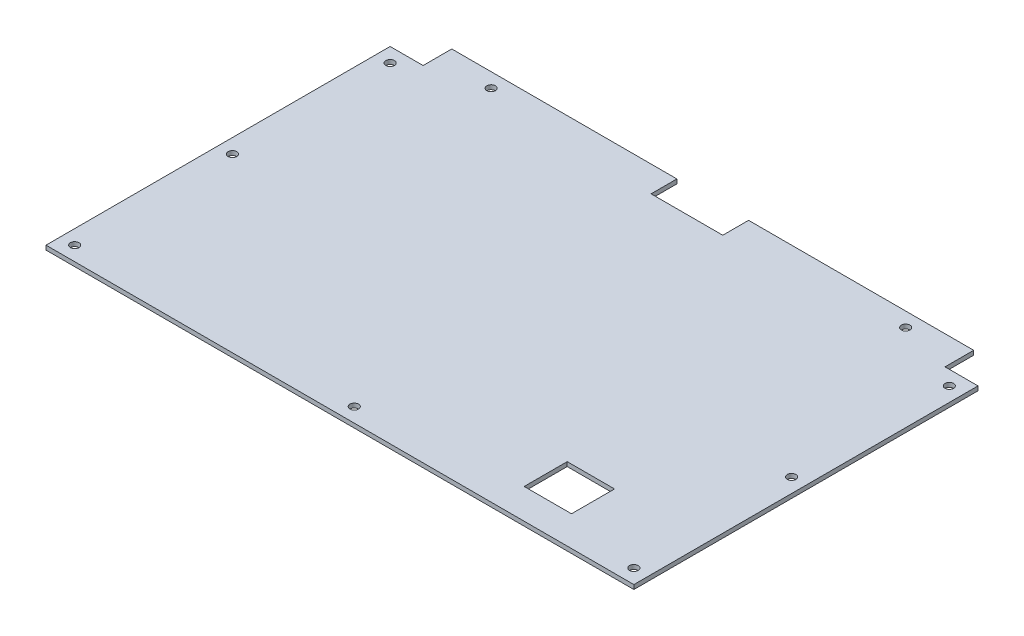
ISO-10303-21;
HEADER;
FILE_DESCRIPTION(('STEP AP214'),'2;1');
FILE_NAME('part.step','',(''),(''),'','','');
FILE_SCHEMA(('AUTOMOTIVE_DESIGN { 1 0 10303 214 1 1 1 1 }'));
ENDSEC;
DATA;
#1=APPLICATION_CONTEXT('core data for automotive mechanical design processes');
#2=APPLICATION_PROTOCOL_DEFINITION('international standard','automotive_design',2000,#1);
#3=PRODUCT_CONTEXT('',#1,'mechanical');
#4=PRODUCT('Part','Part','',(#3));
#5=PRODUCT_RELATED_PRODUCT_CATEGORY('part','',(#4));
#6=PRODUCT_DEFINITION_FORMATION('','',#4);
#7=PRODUCT_DEFINITION_CONTEXT('part definition',#1,'design');
#8=PRODUCT_DEFINITION('design','',#6,#7);
#9=PRODUCT_DEFINITION_SHAPE('','',#8);
#10=(LENGTH_UNIT() NAMED_UNIT(*) SI_UNIT(.MILLI.,.METRE.));
#11=(NAMED_UNIT(*) PLANE_ANGLE_UNIT() SI_UNIT($,.RADIAN.));
#12=(NAMED_UNIT(*) SI_UNIT($,.STERADIAN.) SOLID_ANGLE_UNIT());
#13=UNCERTAINTY_MEASURE_WITH_UNIT(LENGTH_MEASURE(1.E-05),#10,'distance_accuracy_value','');
#14=(GEOMETRIC_REPRESENTATION_CONTEXT(3) GLOBAL_UNCERTAINTY_ASSIGNED_CONTEXT((#13)) GLOBAL_UNIT_ASSIGNED_CONTEXT((#10,
#11,#12)) REPRESENTATION_CONTEXT('',''));
#15=CARTESIAN_POINT('',(0.,0.,0.));
#16=DIRECTION('',(0.,0.,1.));
#17=DIRECTION('',(1.,0.,0.));
#18=AXIS2_PLACEMENT_3D('',#15,#16,#17);
#19=CARTESIAN_POINT('',(0.,3.,0.));
#20=DIRECTION('',(0.,1.,0.));
#21=DIRECTION('',(0.,0.,1.));
#22=AXIS2_PLACEMENT_3D('',#19,#20,#21);
#23=PLANE('',#22);
#24=CARTESIAN_POINT('',(144.549746063773,3.,-130.));
#25=DIRECTION('',(0.,1.,0.));
#26=DIRECTION('',(0.,0.,1.));
#27=AXIS2_PLACEMENT_3D('',#24,#25,#26);
#28=CIRCLE('',#27,2.99999999999999);
#29=CARTESIAN_POINT('',(144.549746063773,3.,-127.));
#30=VERTEX_POINT('',#29);
#31=EDGE_CURVE('E209',#30,#30,#28,.T.);
#32=ORIENTED_EDGE('',*,*,#31,.F.);
#33=EDGE_LOOP('',(#32));
#34=FACE_BOUND('',#33,.T.);
#35=CARTESIAN_POINT('',(195.,3.,-110.));
#36=DIRECTION('',(0.,1.,0.));
#37=DIRECTION('',(0.,0.,-1.));
#38=AXIS2_PLACEMENT_3D('',#35,#36,#37);
#39=CIRCLE('',#38,2.99999999999999);
#40=CARTESIAN_POINT('',(195.,3.,-113.));
#41=VERTEX_POINT('',#40);
#42=EDGE_CURVE('E225',#41,#41,#39,.T.);
#43=ORIENTED_EDGE('',*,*,#42,.F.);
#44=EDGE_LOOP('',(#43));
#45=FACE_BOUND('',#44,.T.);
#46=CARTESIAN_POINT('',(195.,3.,110.));
#47=DIRECTION('',(0.,1.,0.));
#48=DIRECTION('',(0.,0.,1.));
#49=AXIS2_PLACEMENT_3D('',#46,#47,#48);
#50=CIRCLE('',#49,2.99999999999999);
#51=CARTESIAN_POINT('',(195.,3.,113.));
#52=VERTEX_POINT('',#51);
#53=EDGE_CURVE('E241',#52,#52,#50,.T.);
#54=ORIENTED_EDGE('',*,*,#53,.F.);
#55=EDGE_LOOP('',(#54));
#56=FACE_BOUND('',#55,.T.);
#57=CARTESIAN_POINT('',(-195.,3.,0.));
#58=DIRECTION('',(0.,1.,0.));
#59=DIRECTION('',(0.,0.,1.));
#60=AXIS2_PLACEMENT_3D('',#57,#58,#59);
#61=CIRCLE('',#60,2.99999999999999);
#62=CARTESIAN_POINT('',(-195.,3.,2.99999999999999));
#63=VERTEX_POINT('',#62);
#64=EDGE_CURVE('E257',#63,#63,#61,.T.);
#65=ORIENTED_EDGE('',*,*,#64,.F.);
#66=EDGE_LOOP('',(#65));
#67=FACE_BOUND('',#66,.T.);
#68=DIRECTION('',(0.,0.,-1.));
#69=VECTOR('',#68,1.);
#70=CARTESIAN_POINT('',(205.,3.,-120.));
#71=LINE('',#70,#69);
#72=CARTESIAN_POINT('',(205.,3.,120.));
#73=VERTEX_POINT('',#72);
#74=CARTESIAN_POINT('',(205.,3.,-120.));
#75=VERTEX_POINT('',#74);
#76=EDGE_CURVE('E273',#73,#75,#71,.T.);
#77=ORIENTED_EDGE('',*,*,#76,.T.);
#78=DIRECTION('',(-1.,0.,0.));
#79=VECTOR('',#78,1.);
#80=CARTESIAN_POINT('',(182.,3.,-120.));
#81=LINE('',#80,#79);
#82=CARTESIAN_POINT('',(182.,3.,-120.));
#83=VERTEX_POINT('',#82);
#84=EDGE_CURVE('E277',#75,#83,#81,.T.);
#85=ORIENTED_EDGE('',*,*,#84,.T.);
#86=DIRECTION('',(0.,0.,-1.));
#87=VECTOR('',#86,1.);
#88=CARTESIAN_POINT('',(182.,3.,-120.));
#89=LINE('',#88,#87);
#90=CARTESIAN_POINT('',(182.,3.,-140.));
#91=VERTEX_POINT('',#90);
#92=EDGE_CURVE('E281',#83,#91,#89,.T.);
#93=ORIENTED_EDGE('',*,*,#92,.T.);
#94=DIRECTION('',(-1.,0.,0.));
#95=VECTOR('',#94,1.);
#96=CARTESIAN_POINT('',(25.0000000000001,3.,-140.));
#97=LINE('',#96,#95);
#98=CARTESIAN_POINT('',(25.0000000000001,3.,-140.));
#99=VERTEX_POINT('',#98);
#100=EDGE_CURVE('E284',#91,#99,#97,.T.);
#101=ORIENTED_EDGE('',*,*,#100,.T.);
#102=DIRECTION('',(0.,0.,1.));
#103=VECTOR('',#102,1.);
#104=CARTESIAN_POINT('',(25.0000000000001,3.,-140.));
#105=LINE('',#104,#103);
#106=CARTESIAN_POINT('',(25.0000000000001,3.,-122.));
#107=VERTEX_POINT('',#106);
#108=EDGE_CURVE('E287',#99,#107,#105,.T.);
#109=ORIENTED_EDGE('',*,*,#108,.T.);
#110=DIRECTION('',(-1.,0.,0.));
#111=VECTOR('',#110,1.);
#112=CARTESIAN_POINT('',(-24.9999999999999,3.,-122.));
#113=LINE('',#112,#111);
#114=CARTESIAN_POINT('',(-24.9999999999999,3.,-122.));
#115=VERTEX_POINT('',#114);
#116=EDGE_CURVE('E290',#107,#115,#113,.T.);
#117=ORIENTED_EDGE('',*,*,#116,.T.);
#118=DIRECTION('',(0.,0.,-1.));
#119=VECTOR('',#118,1.);
#120=CARTESIAN_POINT('',(-24.9999999999999,3.,-122.));
#121=LINE('',#120,#119);
#122=CARTESIAN_POINT('',(-24.9999999999999,3.,-140.));
#123=VERTEX_POINT('',#122);
#124=EDGE_CURVE('E293',#115,#123,#121,.T.);
#125=ORIENTED_EDGE('',*,*,#124,.T.);
#126=DIRECTION('',(-1.,0.,0.));
#127=VECTOR('',#126,1.);
#128=CARTESIAN_POINT('',(-182.,3.,-140.));
#129=LINE('',#128,#127);
#130=CARTESIAN_POINT('',(-182.,3.,-140.));
#131=VERTEX_POINT('',#130);
#132=EDGE_CURVE('E296',#123,#131,#129,.T.);
#133=ORIENTED_EDGE('',*,*,#132,.T.);
#134=DIRECTION('',(0.,0.,1.));
#135=VECTOR('',#134,1.);
#136=CARTESIAN_POINT('',(-182.,3.,-120.));
#137=LINE('',#136,#135);
#138=CARTESIAN_POINT('',(-182.,3.,-120.));
#139=VERTEX_POINT('',#138);
#140=EDGE_CURVE('E299',#131,#139,#137,.T.);
#141=ORIENTED_EDGE('',*,*,#140,.T.);
#142=DIRECTION('',(-1.,0.,0.));
#143=VECTOR('',#142,1.);
#144=CARTESIAN_POINT('',(-205.,3.,-120.));
#145=LINE('',#144,#143);
#146=CARTESIAN_POINT('',(-205.,3.,-120.));
#147=VERTEX_POINT('',#146);
#148=EDGE_CURVE('E302',#139,#147,#145,.T.);
#149=ORIENTED_EDGE('',*,*,#148,.T.);
#150=DIRECTION('',(0.,0.,1.));
#151=VECTOR('',#150,1.);
#152=CARTESIAN_POINT('',(-205.,3.,-120.));
#153=LINE('',#152,#151);
#154=CARTESIAN_POINT('',(-205.,3.,120.));
#155=VERTEX_POINT('',#154);
#156=EDGE_CURVE('E305',#147,#155,#153,.T.);
#157=ORIENTED_EDGE('',*,*,#156,.T.);
#158=DIRECTION('',(1.,0.,0.));
#159=VECTOR('',#158,1.);
#160=CARTESIAN_POINT('',(-205.,3.,120.));
#161=LINE('',#160,#159);
#162=EDGE_CURVE('E308',#155,#73,#161,.T.);
#163=ORIENTED_EDGE('',*,*,#162,.T.);
#164=EDGE_LOOP('',(#77,#85,#93,#101,#109,#117,#125,#133,#141,#149,#157,#163));
#165=FACE_BOUND('',#164,.T.);
#166=CARTESIAN_POINT('',(-195.,3.,-110.));
#167=DIRECTION('',(0.,1.,0.));
#168=DIRECTION('',(0.,0.,1.));
#169=AXIS2_PLACEMENT_3D('',#166,#167,#168);
#170=CIRCLE('',#169,2.99999999999999);
#171=CARTESIAN_POINT('',(-195.,3.,-107.));
#172=VERTEX_POINT('',#171);
#173=EDGE_CURVE('E265',#172,#172,#170,.T.);
#174=ORIENTED_EDGE('',*,*,#173,.F.);
#175=EDGE_LOOP('',(#174));
#176=FACE_BOUND('',#175,.T.);
#177=CARTESIAN_POINT('',(-195.,3.,110.));
#178=DIRECTION('',(0.,1.,0.));
#179=DIRECTION('',(0.,0.,-1.));
#180=AXIS2_PLACEMENT_3D('',#177,#178,#179);
#181=CIRCLE('',#180,2.99999999999999);
#182=CARTESIAN_POINT('',(-195.,3.,107.));
#183=VERTEX_POINT('',#182);
#184=EDGE_CURVE('E249',#183,#183,#181,.T.);
#185=ORIENTED_EDGE('',*,*,#184,.F.);
#186=EDGE_LOOP('',(#185));
#187=FACE_BOUND('',#186,.T.);
#188=CARTESIAN_POINT('',(195.,3.,0.));
#189=DIRECTION('',(0.,1.,0.));
#190=DIRECTION('',(0.,0.,-1.));
#191=AXIS2_PLACEMENT_3D('',#188,#189,#190);
#192=CIRCLE('',#191,2.99999999999999);
#193=CARTESIAN_POINT('',(195.,3.,-2.99999999999999));
#194=VERTEX_POINT('',#193);
#195=EDGE_CURVE('E233',#194,#194,#192,.T.);
#196=ORIENTED_EDGE('',*,*,#195,.F.);
#197=EDGE_LOOP('',(#196));
#198=FACE_BOUND('',#197,.T.);
#199=CARTESIAN_POINT('',(0.,3.,110.));
#200=DIRECTION('',(0.,1.,0.));
#201=DIRECTION('',(0.,0.,1.));
#202=AXIS2_PLACEMENT_3D('',#199,#200,#201);
#203=CIRCLE('',#202,3.);
#204=CARTESIAN_POINT('',(0.,3.,113.));
#205=VERTEX_POINT('',#204);
#206=EDGE_CURVE('E217',#205,#205,#203,.T.);
#207=ORIENTED_EDGE('',*,*,#206,.F.);
#208=EDGE_LOOP('',(#207));
#209=FACE_BOUND('',#208,.T.);
#210=CARTESIAN_POINT('',(-144.549746063773,3.,-130.));
#211=DIRECTION('',(0.,1.,0.));
#212=DIRECTION('',(0.,0.,-1.));
#213=AXIS2_PLACEMENT_3D('',#210,#211,#212);
#214=CIRCLE('',#213,2.99999999999999);
#215=CARTESIAN_POINT('',(-144.549746063773,3.,-133.));
#216=VERTEX_POINT('',#215);
#217=EDGE_CURVE('E201',#216,#216,#214,.T.);
#218=ORIENTED_EDGE('',*,*,#217,.F.);
#219=EDGE_LOOP('',(#218));
#220=FACE_BOUND('',#219,.T.);
#221=DIRECTION('',(1.,0.,0.));
#222=VECTOR('',#221,1.);
#223=CARTESIAN_POINT('',(0.,3.,69.));
#224=LINE('',#223,#222);
#225=CARTESIAN_POINT('',(107.496419688977,3.,69.));
#226=VERTEX_POINT('',#225);
#227=CARTESIAN_POINT('',(140.496419688976,3.,69.));
#228=VERTEX_POINT('',#227);
#229=EDGE_CURVE('E186',#226,#228,#224,.T.);
#230=ORIENTED_EDGE('',*,*,#229,.T.);
#231=DIRECTION('',(0.,0.,1.));
#232=VECTOR('',#231,1.);
#233=CARTESIAN_POINT('',(140.496419688976,3.,0.));
#234=LINE('',#233,#232);
#235=CARTESIAN_POINT('',(140.496419688976,3.,99.));
#236=VERTEX_POINT('',#235);
#237=EDGE_CURVE('E55',#228,#236,#234,.T.);
#238=ORIENTED_EDGE('',*,*,#237,.T.);
#239=DIRECTION('',(1.,0.,0.));
#240=VECTOR('',#239,1.);
#241=CARTESIAN_POINT('',(0.,3.,99.));
#242=LINE('',#241,#240);
#243=CARTESIAN_POINT('',(107.496419688977,3.,99.));
#244=VERTEX_POINT('',#243);
#245=EDGE_CURVE('E173',#244,#236,#242,.T.);
#246=ORIENTED_EDGE('',*,*,#245,.F.);
#247=DIRECTION('',(0.,0.,1.));
#248=VECTOR('',#247,1.);
#249=CARTESIAN_POINT('',(107.496419688977,3.,0.));
#250=LINE('',#249,#248);
#251=EDGE_CURVE('E177',#226,#244,#250,.T.);
#252=ORIENTED_EDGE('',*,*,#251,.F.);
#253=EDGE_LOOP('',(#230,#238,#246,#252));
#254=FACE_BOUND('',#253,.T.);
#255=ADVANCED_FACE('F39',(#34,#45,#56,#67,#165,#176,#187,#198,#209,#220,#254),#23,.T.);
#256=CARTESIAN_POINT('',(0.,0.,0.));
#257=DIRECTION('',(0.,1.,0.));
#258=DIRECTION('',(0.,0.,1.));
#259=AXIS2_PLACEMENT_3D('',#256,#257,#258);
#260=PLANE('',#259);
#261=CARTESIAN_POINT('',(-144.549746063773,0.,-130.));
#262=DIRECTION('',(0.,1.,0.));
#263=DIRECTION('',(0.,0.,-1.));
#264=AXIS2_PLACEMENT_3D('',#261,#262,#263);
#265=CIRCLE('',#264,2.99999999999999);
#266=CARTESIAN_POINT('',(-144.549746063773,0.,-133.));
#267=VERTEX_POINT('',#266);
#268=EDGE_CURVE('E195',#267,#267,#265,.T.);
#269=ORIENTED_EDGE('',*,*,#268,.T.);
#270=EDGE_LOOP('',(#269));
#271=FACE_BOUND('',#270,.T.);
#272=CARTESIAN_POINT('',(144.549746063773,0.,-130.));
#273=DIRECTION('',(0.,1.,0.));
#274=DIRECTION('',(0.,0.,1.));
#275=AXIS2_PLACEMENT_3D('',#272,#273,#274);
#276=CIRCLE('',#275,2.99999999999999);
#277=CARTESIAN_POINT('',(144.549746063773,0.,-127.));
#278=VERTEX_POINT('',#277);
#279=EDGE_CURVE('E205',#278,#278,#276,.T.);
#280=ORIENTED_EDGE('',*,*,#279,.T.);
#281=EDGE_LOOP('',(#280));
#282=FACE_BOUND('',#281,.T.);
#283=CARTESIAN_POINT('',(0.,0.,110.));
#284=DIRECTION('',(0.,1.,0.));
#285=DIRECTION('',(0.,0.,1.));
#286=AXIS2_PLACEMENT_3D('',#283,#284,#285);
#287=CIRCLE('',#286,3.);
#288=CARTESIAN_POINT('',(0.,0.,113.));
#289=VERTEX_POINT('',#288);
#290=EDGE_CURVE('E213',#289,#289,#287,.T.);
#291=ORIENTED_EDGE('',*,*,#290,.T.);
#292=EDGE_LOOP('',(#291));
#293=FACE_BOUND('',#292,.T.);
#294=CARTESIAN_POINT('',(195.,0.,-110.));
#295=DIRECTION('',(0.,1.,0.));
#296=DIRECTION('',(0.,0.,-1.));
#297=AXIS2_PLACEMENT_3D('',#294,#295,#296);
#298=CIRCLE('',#297,2.99999999999999);
#299=CARTESIAN_POINT('',(195.,0.,-113.));
#300=VERTEX_POINT('',#299);
#301=EDGE_CURVE('E221',#300,#300,#298,.T.);
#302=ORIENTED_EDGE('',*,*,#301,.T.);
#303=EDGE_LOOP('',(#302));
#304=FACE_BOUND('',#303,.T.);
#305=CARTESIAN_POINT('',(195.,0.,0.));
#306=DIRECTION('',(0.,1.,0.));
#307=DIRECTION('',(0.,0.,-1.));
#308=AXIS2_PLACEMENT_3D('',#305,#306,#307);
#309=CIRCLE('',#308,2.99999999999999);
#310=CARTESIAN_POINT('',(195.,0.,-2.99999999999999));
#311=VERTEX_POINT('',#310);
#312=EDGE_CURVE('E229',#311,#311,#309,.T.);
#313=ORIENTED_EDGE('',*,*,#312,.T.);
#314=EDGE_LOOP('',(#313));
#315=FACE_BOUND('',#314,.T.);
#316=CARTESIAN_POINT('',(195.,0.,110.));
#317=DIRECTION('',(0.,1.,0.));
#318=DIRECTION('',(0.,0.,1.));
#319=AXIS2_PLACEMENT_3D('',#316,#317,#318);
#320=CIRCLE('',#319,2.99999999999999);
#321=CARTESIAN_POINT('',(195.,0.,113.));
#322=VERTEX_POINT('',#321);
#323=EDGE_CURVE('E237',#322,#322,#320,.T.);
#324=ORIENTED_EDGE('',*,*,#323,.T.);
#325=EDGE_LOOP('',(#324));
#326=FACE_BOUND('',#325,.T.);
#327=CARTESIAN_POINT('',(-195.,0.,110.));
#328=DIRECTION('',(0.,1.,0.));
#329=DIRECTION('',(0.,0.,-1.));
#330=AXIS2_PLACEMENT_3D('',#327,#328,#329);
#331=CIRCLE('',#330,2.99999999999999);
#332=CARTESIAN_POINT('',(-195.,0.,107.));
#333=VERTEX_POINT('',#332);
#334=EDGE_CURVE('E245',#333,#333,#331,.T.);
#335=ORIENTED_EDGE('',*,*,#334,.T.);
#336=EDGE_LOOP('',(#335));
#337=FACE_BOUND('',#336,.T.);
#338=CARTESIAN_POINT('',(-195.,0.,0.));
#339=DIRECTION('',(0.,1.,0.));
#340=DIRECTION('',(0.,0.,1.));
#341=AXIS2_PLACEMENT_3D('',#338,#339,#340);
#342=CIRCLE('',#341,2.99999999999999);
#343=CARTESIAN_POINT('',(-195.,0.,2.99999999999999));
#344=VERTEX_POINT('',#343);
#345=EDGE_CURVE('E253',#344,#344,#342,.T.);
#346=ORIENTED_EDGE('',*,*,#345,.T.);
#347=EDGE_LOOP('',(#346));
#348=FACE_BOUND('',#347,.T.);
#349=CARTESIAN_POINT('',(-195.,0.,-110.));
#350=DIRECTION('',(0.,1.,0.));
#351=DIRECTION('',(0.,0.,1.));
#352=AXIS2_PLACEMENT_3D('',#349,#350,#351);
#353=CIRCLE('',#352,2.99999999999999);
#354=CARTESIAN_POINT('',(-195.,0.,-107.));
#355=VERTEX_POINT('',#354);
#356=EDGE_CURVE('E261',#355,#355,#353,.T.);
#357=ORIENTED_EDGE('',*,*,#356,.T.);
#358=EDGE_LOOP('',(#357));
#359=FACE_BOUND('',#358,.T.);
#360=DIRECTION('',(0.,0.,-1.));
#361=VECTOR('',#360,1.);
#362=CARTESIAN_POINT('',(205.,0.,-120.));
#363=LINE('',#362,#361);
#364=CARTESIAN_POINT('',(205.,0.,120.));
#365=VERTEX_POINT('',#364);
#366=CARTESIAN_POINT('',(205.,0.,-120.));
#367=VERTEX_POINT('',#366);
#368=EDGE_CURVE('E269',#365,#367,#363,.T.);
#369=ORIENTED_EDGE('',*,*,#368,.F.);
#370=DIRECTION('',(1.,0.,0.));
#371=VECTOR('',#370,1.);
#372=CARTESIAN_POINT('',(-205.,0.,120.));
#373=LINE('',#372,#371);
#374=CARTESIAN_POINT('',(-205.,0.,120.));
#375=VERTEX_POINT('',#374);
#376=EDGE_CURVE('E278',#375,#365,#373,.T.);
#377=ORIENTED_EDGE('',*,*,#376,.F.);
#378=DIRECTION('',(0.,0.,1.));
#379=VECTOR('',#378,1.);
#380=CARTESIAN_POINT('',(-205.,0.,-120.));
#381=LINE('',#380,#379);
#382=CARTESIAN_POINT('',(-205.,0.,-120.));
#383=VERTEX_POINT('',#382);
#384=EDGE_CURVE('E342',#383,#375,#381,.T.);
#385=ORIENTED_EDGE('',*,*,#384,.F.);
#386=DIRECTION('',(-1.,0.,0.));
#387=VECTOR('',#386,1.);
#388=CARTESIAN_POINT('',(-205.,0.,-120.));
#389=LINE('',#388,#387);
#390=CARTESIAN_POINT('',(-182.,0.,-120.));
#391=VERTEX_POINT('',#390);
#392=EDGE_CURVE('E339',#391,#383,#389,.T.);
#393=ORIENTED_EDGE('',*,*,#392,.F.);
#394=DIRECTION('',(0.,0.,1.));
#395=VECTOR('',#394,1.);
#396=CARTESIAN_POINT('',(-182.,0.,-120.));
#397=LINE('',#396,#395);
#398=CARTESIAN_POINT('',(-182.,0.,-140.));
#399=VERTEX_POINT('',#398);
#400=EDGE_CURVE('E336',#399,#391,#397,.T.);
#401=ORIENTED_EDGE('',*,*,#400,.F.);
#402=DIRECTION('',(-1.,0.,0.));
#403=VECTOR('',#402,1.);
#404=CARTESIAN_POINT('',(-182.,0.,-140.));
#405=LINE('',#404,#403);
#406=CARTESIAN_POINT('',(-24.9999999999999,0.,-140.));
#407=VERTEX_POINT('',#406);
#408=EDGE_CURVE('E333',#407,#399,#405,.T.);
#409=ORIENTED_EDGE('',*,*,#408,.F.);
#410=DIRECTION('',(0.,0.,-1.));
#411=VECTOR('',#410,1.);
#412=CARTESIAN_POINT('',(-24.9999999999999,0.,-122.));
#413=LINE('',#412,#411);
#414=CARTESIAN_POINT('',(-24.9999999999999,0.,-122.));
#415=VERTEX_POINT('',#414);
#416=EDGE_CURVE('E330',#415,#407,#413,.T.);
#417=ORIENTED_EDGE('',*,*,#416,.F.);
#418=DIRECTION('',(-1.,0.,0.));
#419=VECTOR('',#418,1.);
#420=CARTESIAN_POINT('',(-24.9999999999999,0.,-122.));
#421=LINE('',#420,#419);
#422=CARTESIAN_POINT('',(25.0000000000001,0.,-122.));
#423=VERTEX_POINT('',#422);
#424=EDGE_CURVE('E327',#423,#415,#421,.T.);
#425=ORIENTED_EDGE('',*,*,#424,.F.);
#426=DIRECTION('',(0.,0.,1.));
#427=VECTOR('',#426,1.);
#428=CARTESIAN_POINT('',(25.0000000000001,0.,-140.));
#429=LINE('',#428,#427);
#430=CARTESIAN_POINT('',(25.0000000000001,0.,-140.));
#431=VERTEX_POINT('',#430);
#432=EDGE_CURVE('E324',#431,#423,#429,.T.);
#433=ORIENTED_EDGE('',*,*,#432,.F.);
#434=DIRECTION('',(-1.,0.,0.));
#435=VECTOR('',#434,1.);
#436=CARTESIAN_POINT('',(25.0000000000001,0.,-140.));
#437=LINE('',#436,#435);
#438=CARTESIAN_POINT('',(182.,0.,-140.));
#439=VERTEX_POINT('',#438);
#440=EDGE_CURVE('E321',#439,#431,#437,.T.);
#441=ORIENTED_EDGE('',*,*,#440,.F.);
#442=DIRECTION('',(0.,0.,-1.));
#443=VECTOR('',#442,1.);
#444=CARTESIAN_POINT('',(182.,0.,-120.));
#445=LINE('',#444,#443);
#446=CARTESIAN_POINT('',(182.,0.,-120.));
#447=VERTEX_POINT('',#446);
#448=EDGE_CURVE('E318',#447,#439,#445,.T.);
#449=ORIENTED_EDGE('',*,*,#448,.F.);
#450=DIRECTION('',(-1.,0.,0.));
#451=VECTOR('',#450,1.);
#452=CARTESIAN_POINT('',(182.,0.,-120.));
#453=LINE('',#452,#451);
#454=EDGE_CURVE('E315',#367,#447,#453,.T.);
#455=ORIENTED_EDGE('',*,*,#454,.F.);
#456=EDGE_LOOP('',(#369,#377,#385,#393,#401,#409,#417,#425,#433,#441,#449,#455));
#457=FACE_BOUND('',#456,.T.);
#458=DIRECTION('',(0.,0.,1.));
#459=VECTOR('',#458,1.);
#460=CARTESIAN_POINT('',(140.496419688976,0.,0.));
#461=LINE('',#460,#459);
#462=CARTESIAN_POINT('',(140.496419688976,0.,69.));
#463=VERTEX_POINT('',#462);
#464=CARTESIAN_POINT('',(140.496419688976,0.,99.));
#465=VERTEX_POINT('',#464);
#466=EDGE_CURVE('E162',#463,#465,#461,.T.);
#467=ORIENTED_EDGE('',*,*,#466,.F.);
#468=DIRECTION('',(1.,0.,0.));
#469=VECTOR('',#468,1.);
#470=CARTESIAN_POINT('',(0.,0.,69.));
#471=LINE('',#470,#469);
#472=CARTESIAN_POINT('',(107.496419688977,0.,69.));
#473=VERTEX_POINT('',#472);
#474=EDGE_CURVE('E153',#473,#463,#471,.T.);
#475=ORIENTED_EDGE('',*,*,#474,.F.);
#476=DIRECTION('',(0.,0.,1.));
#477=VECTOR('',#476,1.);
#478=CARTESIAN_POINT('',(107.496419688977,0.,0.));
#479=LINE('',#478,#477);
#480=CARTESIAN_POINT('',(107.496419688977,0.,99.));
#481=VERTEX_POINT('',#480);
#482=EDGE_CURVE('E63',#473,#481,#479,.T.);
#483=ORIENTED_EDGE('',*,*,#482,.T.);
#484=DIRECTION('',(1.,0.,0.));
#485=VECTOR('',#484,1.);
#486=CARTESIAN_POINT('',(0.,0.,99.));
#487=LINE('',#486,#485);
#488=EDGE_CURVE('E167',#481,#465,#487,.T.);
#489=ORIENTED_EDGE('',*,*,#488,.T.);
#490=EDGE_LOOP('',(#467,#475,#483,#489));
#491=FACE_BOUND('',#490,.T.);
#492=ADVANCED_FACE('F170',(#271,#282,#293,#304,#315,#326,#337,#348,#359,#457,#491),#260,.F.);
#493=CARTESIAN_POINT('',(205.,3.,-120.));
#494=DIRECTION('',(-1.,0.,0.));
#495=DIRECTION('',(0.,0.,1.));
#496=AXIS2_PLACEMENT_3D('',#493,#494,#495);
#497=PLANE('',#496);
#498=ORIENTED_EDGE('',*,*,#368,.T.);
#499=DIRECTION('',(0.,-1.,0.));
#500=VECTOR('',#499,1.);
#501=CARTESIAN_POINT('',(205.,3.,-120.));
#502=LINE('',#501,#500);
#503=EDGE_CURVE('E11',#75,#367,#502,.T.);
#504=ORIENTED_EDGE('',*,*,#503,.F.);
#505=ORIENTED_EDGE('',*,*,#76,.F.);
#506=DIRECTION('',(0.,-1.,0.));
#507=VECTOR('',#506,1.);
#508=CARTESIAN_POINT('',(205.,3.,120.));
#509=LINE('',#508,#507);
#510=EDGE_CURVE('E311',#73,#365,#509,.T.);
#511=ORIENTED_EDGE('',*,*,#510,.T.);
#512=EDGE_LOOP('',(#498,#504,#505,#511));
#513=FACE_BOUND('',#512,.T.);
#514=ADVANCED_FACE('F41',(#513),#497,.F.);
#515=CARTESIAN_POINT('',(182.,3.,-120.));
#516=DIRECTION('',(0.,0.,1.));
#517=DIRECTION('',(1.,0.,0.));
#518=AXIS2_PLACEMENT_3D('',#515,#516,#517);
#519=PLANE('',#518);
#520=ORIENTED_EDGE('',*,*,#454,.T.);
#521=DIRECTION('',(0.,-1.,0.));
#522=VECTOR('',#521,1.);
#523=CARTESIAN_POINT('',(182.,3.,-120.));
#524=LINE('',#523,#522);
#525=EDGE_CURVE('E48',#83,#447,#524,.T.);
#526=ORIENTED_EDGE('',*,*,#525,.F.);
#527=ORIENTED_EDGE('',*,*,#84,.F.);
#528=ORIENTED_EDGE('',*,*,#503,.T.);
#529=EDGE_LOOP('',(#520,#526,#527,#528));
#530=FACE_BOUND('',#529,.T.);
#531=ADVANCED_FACE('F413',(#530),#519,.F.);
#532=CARTESIAN_POINT('',(182.,3.,-120.));
#533=DIRECTION('',(-1.,0.,0.));
#534=DIRECTION('',(0.,0.,1.));
#535=AXIS2_PLACEMENT_3D('',#532,#533,#534);
#536=PLANE('',#535);
#537=ORIENTED_EDGE('',*,*,#448,.T.);
#538=DIRECTION('',(0.,-1.,0.));
#539=VECTOR('',#538,1.);
#540=CARTESIAN_POINT('',(182.,3.,-140.));
#541=LINE('',#540,#539);
#542=EDGE_CURVE('E382',#91,#439,#541,.T.);
#543=ORIENTED_EDGE('',*,*,#542,.F.);
#544=ORIENTED_EDGE('',*,*,#92,.F.);
#545=ORIENTED_EDGE('',*,*,#525,.T.);
#546=EDGE_LOOP('',(#537,#543,#544,#545));
#547=FACE_BOUND('',#546,.T.);
#548=ADVANCED_FACE('F391',(#547),#536,.F.);
#549=CARTESIAN_POINT('',(25.0000000000001,3.,-140.));
#550=DIRECTION('',(0.,0.,1.));
#551=DIRECTION('',(1.,0.,0.));
#552=AXIS2_PLACEMENT_3D('',#549,#550,#551);
#553=PLANE('',#552);
#554=ORIENTED_EDGE('',*,*,#440,.T.);
#555=DIRECTION('',(0.,-1.,0.));
#556=VECTOR('',#555,1.);
#557=CARTESIAN_POINT('',(25.0000000000001,3.,-140.));
#558=LINE('',#557,#556);
#559=EDGE_CURVE('E378',#99,#431,#558,.T.);
#560=ORIENTED_EDGE('',*,*,#559,.F.);
#561=ORIENTED_EDGE('',*,*,#100,.F.);
#562=ORIENTED_EDGE('',*,*,#542,.T.);
#563=EDGE_LOOP('',(#554,#560,#561,#562));
#564=FACE_BOUND('',#563,.T.);
#565=ADVANCED_FACE('F401',(#564),#553,.F.);
#566=CARTESIAN_POINT('',(25.0000000000001,3.,-140.));
#567=DIRECTION('',(1.,0.,0.));
#568=DIRECTION('',(0.,0.,-1.));
#569=AXIS2_PLACEMENT_3D('',#566,#567,#568);
#570=PLANE('',#569);
#571=ORIENTED_EDGE('',*,*,#432,.T.);
#572=DIRECTION('',(0.,-1.,0.));
#573=VECTOR('',#572,1.);
#574=CARTESIAN_POINT('',(25.0000000000001,3.,-122.));
#575=LINE('',#574,#573);
#576=EDGE_CURVE('E374',#107,#423,#575,.T.);
#577=ORIENTED_EDGE('',*,*,#576,.F.);
#578=ORIENTED_EDGE('',*,*,#108,.F.);
#579=ORIENTED_EDGE('',*,*,#559,.T.);
#580=EDGE_LOOP('',(#571,#577,#578,#579));
#581=FACE_BOUND('',#580,.T.);
#582=ADVANCED_FACE('F405',(#581),#570,.F.);
#583=CARTESIAN_POINT('',(-24.9999999999999,3.,-122.));
#584=DIRECTION('',(0.,0.,1.));
#585=DIRECTION('',(1.,0.,0.));
#586=AXIS2_PLACEMENT_3D('',#583,#584,#585);
#587=PLANE('',#586);
#588=ORIENTED_EDGE('',*,*,#424,.T.);
#589=DIRECTION('',(0.,-1.,0.));
#590=VECTOR('',#589,1.);
#591=CARTESIAN_POINT('',(-24.9999999999999,3.,-122.));
#592=LINE('',#591,#590);
#593=EDGE_CURVE('E370',#115,#415,#592,.T.);
#594=ORIENTED_EDGE('',*,*,#593,.F.);
#595=ORIENTED_EDGE('',*,*,#116,.F.);
#596=ORIENTED_EDGE('',*,*,#576,.T.);
#597=EDGE_LOOP('',(#588,#594,#595,#596));
#598=FACE_BOUND('',#597,.T.);
#599=ADVANCED_FACE('F446',(#598),#587,.F.);
#600=CARTESIAN_POINT('',(-24.9999999999999,3.,-122.));
#601=DIRECTION('',(-1.,0.,0.));
#602=DIRECTION('',(0.,0.,1.));
#603=AXIS2_PLACEMENT_3D('',#600,#601,#602);
#604=PLANE('',#603);
#605=ORIENTED_EDGE('',*,*,#416,.T.);
#606=DIRECTION('',(0.,-1.,0.));
#607=VECTOR('',#606,1.);
#608=CARTESIAN_POINT('',(-24.9999999999999,3.,-140.));
#609=LINE('',#608,#607);
#610=EDGE_CURVE('E366',#123,#407,#609,.T.);
#611=ORIENTED_EDGE('',*,*,#610,.F.);
#612=ORIENTED_EDGE('',*,*,#124,.F.);
#613=ORIENTED_EDGE('',*,*,#593,.T.);
#614=EDGE_LOOP('',(#605,#611,#612,#613));
#615=FACE_BOUND('',#614,.T.);
#616=ADVANCED_FACE('F444',(#615),#604,.F.);
#617=CARTESIAN_POINT('',(-182.,3.,-140.));
#618=DIRECTION('',(0.,0.,1.));
#619=DIRECTION('',(1.,0.,0.));
#620=AXIS2_PLACEMENT_3D('',#617,#618,#619);
#621=PLANE('',#620);
#622=ORIENTED_EDGE('',*,*,#408,.T.);
#623=DIRECTION('',(0.,-1.,0.));
#624=VECTOR('',#623,1.);
#625=CARTESIAN_POINT('',(-182.,3.,-140.));
#626=LINE('',#625,#624);
#627=EDGE_CURVE('E362',#131,#399,#626,.T.);
#628=ORIENTED_EDGE('',*,*,#627,.F.);
#629=ORIENTED_EDGE('',*,*,#132,.F.);
#630=ORIENTED_EDGE('',*,*,#610,.T.);
#631=EDGE_LOOP('',(#622,#628,#629,#630));
#632=FACE_BOUND('',#631,.T.);
#633=ADVANCED_FACE('F440',(#632),#621,.F.);
#634=CARTESIAN_POINT('',(-182.,3.,-120.));
#635=DIRECTION('',(1.,0.,0.));
#636=DIRECTION('',(0.,0.,-1.));
#637=AXIS2_PLACEMENT_3D('',#634,#635,#636);
#638=PLANE('',#637);
#639=ORIENTED_EDGE('',*,*,#400,.T.);
#640=DIRECTION('',(0.,-1.,0.));
#641=VECTOR('',#640,1.);
#642=CARTESIAN_POINT('',(-182.,3.,-120.));
#643=LINE('',#642,#641);
#644=EDGE_CURVE('E358',#139,#391,#643,.T.);
#645=ORIENTED_EDGE('',*,*,#644,.F.);
#646=ORIENTED_EDGE('',*,*,#140,.F.);
#647=ORIENTED_EDGE('',*,*,#627,.T.);
#648=EDGE_LOOP('',(#639,#645,#646,#647));
#649=FACE_BOUND('',#648,.T.);
#650=ADVANCED_FACE('F435',(#649),#638,.F.);
#651=CARTESIAN_POINT('',(-205.,3.,-120.));
#652=DIRECTION('',(0.,0.,1.));
#653=DIRECTION('',(1.,0.,0.));
#654=AXIS2_PLACEMENT_3D('',#651,#652,#653);
#655=PLANE('',#654);
#656=ORIENTED_EDGE('',*,*,#392,.T.);
#657=DIRECTION('',(0.,-1.,0.));
#658=VECTOR('',#657,1.);
#659=CARTESIAN_POINT('',(-205.,3.,-120.));
#660=LINE('',#659,#658);
#661=EDGE_CURVE('E354',#147,#383,#660,.T.);
#662=ORIENTED_EDGE('',*,*,#661,.F.);
#663=ORIENTED_EDGE('',*,*,#148,.F.);
#664=ORIENTED_EDGE('',*,*,#644,.T.);
#665=EDGE_LOOP('',(#656,#662,#663,#664));
#666=FACE_BOUND('',#665,.T.);
#667=ADVANCED_FACE('F429',(#666),#655,.F.);
#668=CARTESIAN_POINT('',(-205.,3.,-120.));
#669=DIRECTION('',(1.,0.,0.));
#670=DIRECTION('',(0.,0.,-1.));
#671=AXIS2_PLACEMENT_3D('',#668,#669,#670);
#672=PLANE('',#671);
#673=ORIENTED_EDGE('',*,*,#384,.T.);
#674=DIRECTION('',(0.,-1.,0.));
#675=VECTOR('',#674,1.);
#676=CARTESIAN_POINT('',(-205.,3.,120.));
#677=LINE('',#676,#675);
#678=EDGE_CURVE('E350',#155,#375,#677,.T.);
#679=ORIENTED_EDGE('',*,*,#678,.F.);
#680=ORIENTED_EDGE('',*,*,#156,.F.);
#681=ORIENTED_EDGE('',*,*,#661,.T.);
#682=EDGE_LOOP('',(#673,#679,#680,#681));
#683=FACE_BOUND('',#682,.T.);
#684=ADVANCED_FACE('F425',(#683),#672,.F.);
#685=CARTESIAN_POINT('',(-205.,3.,120.));
#686=DIRECTION('',(0.,0.,-1.));
#687=DIRECTION('',(-1.,0.,0.));
#688=AXIS2_PLACEMENT_3D('',#685,#686,#687);
#689=PLANE('',#688);
#690=ORIENTED_EDGE('',*,*,#376,.T.);
#691=ORIENTED_EDGE('',*,*,#510,.F.);
#692=ORIENTED_EDGE('',*,*,#162,.F.);
#693=ORIENTED_EDGE('',*,*,#678,.T.);
#694=EDGE_LOOP('',(#690,#691,#692,#693));
#695=FACE_BOUND('',#694,.T.);
#696=ADVANCED_FACE('F420',(#695),#689,.F.);
#697=CARTESIAN_POINT('',(-195.,3.,-110.));
#698=DIRECTION('',(0.,-1.,0.));
#699=DIRECTION('',(0.,0.,-1.));
#700=AXIS2_PLACEMENT_3D('',#697,#698,#699);
#701=CYLINDRICAL_SURFACE('',#700,2.99999999999999);
#702=ORIENTED_EDGE('',*,*,#173,.T.);
#703=EDGE_LOOP('',(#702));
#704=FACE_BOUND('',#703,.T.);
#705=ORIENTED_EDGE('',*,*,#356,.F.);
#706=EDGE_LOOP('',(#705));
#707=FACE_BOUND('',#706,.T.);
#708=ADVANCED_FACE('F466',(#704,#707),#701,.F.);
#709=CARTESIAN_POINT('',(-195.,3.,0.));
#710=DIRECTION('',(0.,-1.,0.));
#711=DIRECTION('',(0.,0.,-1.));
#712=AXIS2_PLACEMENT_3D('',#709,#710,#711);
#713=CYLINDRICAL_SURFACE('',#712,2.99999999999999);
#714=ORIENTED_EDGE('',*,*,#64,.T.);
#715=EDGE_LOOP('',(#714));
#716=FACE_BOUND('',#715,.T.);
#717=ORIENTED_EDGE('',*,*,#345,.F.);
#718=EDGE_LOOP('',(#717));
#719=FACE_BOUND('',#718,.T.);
#720=ADVANCED_FACE('F504',(#716,#719),#713,.F.);
#721=CARTESIAN_POINT('',(-195.,3.,110.));
#722=DIRECTION('',(0.,-1.,0.));
#723=DIRECTION('',(0.,0.,-1.));
#724=AXIS2_PLACEMENT_3D('',#721,#722,#723);
#725=CYLINDRICAL_SURFACE('',#724,2.99999999999999);
#726=ORIENTED_EDGE('',*,*,#184,.T.);
#727=EDGE_LOOP('',(#726));
#728=FACE_BOUND('',#727,.T.);
#729=ORIENTED_EDGE('',*,*,#334,.F.);
#730=EDGE_LOOP('',(#729));
#731=FACE_BOUND('',#730,.T.);
#732=ADVANCED_FACE('F511',(#728,#731),#725,.F.);
#733=CARTESIAN_POINT('',(195.,3.,110.));
#734=DIRECTION('',(0.,-1.,0.));
#735=DIRECTION('',(0.,0.,-1.));
#736=AXIS2_PLACEMENT_3D('',#733,#734,#735);
#737=CYLINDRICAL_SURFACE('',#736,2.99999999999999);
#738=ORIENTED_EDGE('',*,*,#53,.T.);
#739=EDGE_LOOP('',(#738));
#740=FACE_BOUND('',#739,.T.);
#741=ORIENTED_EDGE('',*,*,#323,.F.);
#742=EDGE_LOOP('',(#741));
#743=FACE_BOUND('',#742,.T.);
#744=ADVANCED_FACE('F518',(#740,#743),#737,.F.);
#745=CARTESIAN_POINT('',(195.,3.,0.));
#746=DIRECTION('',(0.,-1.,0.));
#747=DIRECTION('',(0.,0.,-1.));
#748=AXIS2_PLACEMENT_3D('',#745,#746,#747);
#749=CYLINDRICAL_SURFACE('',#748,2.99999999999999);
#750=ORIENTED_EDGE('',*,*,#195,.T.);
#751=EDGE_LOOP('',(#750));
#752=FACE_BOUND('',#751,.T.);
#753=ORIENTED_EDGE('',*,*,#312,.F.);
#754=EDGE_LOOP('',(#753));
#755=FACE_BOUND('',#754,.T.);
#756=ADVANCED_FACE('F526',(#752,#755),#749,.F.);
#757=CARTESIAN_POINT('',(195.,3.,-110.));
#758=DIRECTION('',(0.,-1.,0.));
#759=DIRECTION('',(0.,0.,-1.));
#760=AXIS2_PLACEMENT_3D('',#757,#758,#759);
#761=CYLINDRICAL_SURFACE('',#760,2.99999999999999);
#762=ORIENTED_EDGE('',*,*,#42,.T.);
#763=EDGE_LOOP('',(#762));
#764=FACE_BOUND('',#763,.T.);
#765=ORIENTED_EDGE('',*,*,#301,.F.);
#766=EDGE_LOOP('',(#765));
#767=FACE_BOUND('',#766,.T.);
#768=ADVANCED_FACE('F534',(#764,#767),#761,.F.);
#769=CARTESIAN_POINT('',(0.,3.,110.));
#770=DIRECTION('',(0.,-1.,0.));
#771=DIRECTION('',(0.,0.,-1.));
#772=AXIS2_PLACEMENT_3D('',#769,#770,#771);
#773=CYLINDRICAL_SURFACE('',#772,3.);
#774=ORIENTED_EDGE('',*,*,#206,.T.);
#775=EDGE_LOOP('',(#774));
#776=FACE_BOUND('',#775,.T.);
#777=ORIENTED_EDGE('',*,*,#290,.F.);
#778=EDGE_LOOP('',(#777));
#779=FACE_BOUND('',#778,.T.);
#780=ADVANCED_FACE('F542',(#776,#779),#773,.F.);
#781=CARTESIAN_POINT('',(144.549746063773,3.,-130.));
#782=DIRECTION('',(0.,-1.,0.));
#783=DIRECTION('',(0.,0.,-1.));
#784=AXIS2_PLACEMENT_3D('',#781,#782,#783);
#785=CYLINDRICAL_SURFACE('',#784,2.99999999999999);
#786=ORIENTED_EDGE('',*,*,#31,.T.);
#787=EDGE_LOOP('',(#786));
#788=FACE_BOUND('',#787,.T.);
#789=ORIENTED_EDGE('',*,*,#279,.F.);
#790=EDGE_LOOP('',(#789));
#791=FACE_BOUND('',#790,.T.);
#792=ADVANCED_FACE('F550',(#788,#791),#785,.F.);
#793=CARTESIAN_POINT('',(-144.549746063773,3.,-130.));
#794=DIRECTION('',(0.,-1.,0.));
#795=DIRECTION('',(0.,0.,-1.));
#796=AXIS2_PLACEMENT_3D('',#793,#794,#795);
#797=CYLINDRICAL_SURFACE('',#796,2.99999999999999);
#798=ORIENTED_EDGE('',*,*,#217,.T.);
#799=EDGE_LOOP('',(#798));
#800=FACE_BOUND('',#799,.T.);
#801=ORIENTED_EDGE('',*,*,#268,.F.);
#802=EDGE_LOOP('',(#801));
#803=FACE_BOUND('',#802,.T.);
#804=ADVANCED_FACE('F558',(#800,#803),#797,.F.);
#805=CARTESIAN_POINT('',(140.496419688976,0.,0.));
#806=DIRECTION('',(-1.,0.,0.));
#807=DIRECTION('',(0.,0.,1.));
#808=AXIS2_PLACEMENT_3D('',#805,#806,#807);
#809=PLANE('',#808);
#810=ORIENTED_EDGE('',*,*,#237,.F.);
#811=DIRECTION('',(0.,1.,0.));
#812=VECTOR('',#811,1.);
#813=CARTESIAN_POINT('',(140.496419688976,0.,69.));
#814=LINE('',#813,#812);
#815=EDGE_CURVE('E156',#463,#228,#814,.T.);
#816=ORIENTED_EDGE('',*,*,#815,.F.);
#817=ORIENTED_EDGE('',*,*,#466,.T.);
#818=DIRECTION('',(0.,1.,0.));
#819=VECTOR('',#818,1.);
#820=CARTESIAN_POINT('',(140.496419688976,0.,99.));
#821=LINE('',#820,#819);
#822=EDGE_CURVE('E192',#465,#236,#821,.T.);
#823=ORIENTED_EDGE('',*,*,#822,.T.);
#824=EDGE_LOOP('',(#810,#816,#817,#823));
#825=FACE_BOUND('',#824,.T.);
#826=ADVANCED_FACE('F164',(#825),#809,.T.);
#827=CARTESIAN_POINT('',(0.,0.,99.));
#828=DIRECTION('',(0.,0.,1.));
#829=DIRECTION('',(1.,0.,0.));
#830=AXIS2_PLACEMENT_3D('',#827,#828,#829);
#831=PLANE('',#830);
#832=ORIENTED_EDGE('',*,*,#245,.T.);
#833=ORIENTED_EDGE('',*,*,#822,.F.);
#834=ORIENTED_EDGE('',*,*,#488,.F.);
#835=DIRECTION('',(0.,1.,0.));
#836=VECTOR('',#835,1.);
#837=CARTESIAN_POINT('',(107.496419688977,0.,99.));
#838=LINE('',#837,#836);
#839=EDGE_CURVE('E196',#481,#244,#838,.T.);
#840=ORIENTED_EDGE('',*,*,#839,.T.);
#841=EDGE_LOOP('',(#832,#833,#834,#840));
#842=FACE_BOUND('',#841,.T.);
#843=ADVANCED_FACE('F573',(#842),#831,.F.);
#844=CARTESIAN_POINT('',(107.496419688977,0.,0.));
#845=DIRECTION('',(-1.,0.,0.));
#846=DIRECTION('',(0.,0.,1.));
#847=AXIS2_PLACEMENT_3D('',#844,#845,#846);
#848=PLANE('',#847);
#849=ORIENTED_EDGE('',*,*,#251,.T.);
#850=ORIENTED_EDGE('',*,*,#839,.F.);
#851=ORIENTED_EDGE('',*,*,#482,.F.);
#852=DIRECTION('',(0.,1.,0.));
#853=VECTOR('',#852,1.);
#854=CARTESIAN_POINT('',(107.496419688977,0.,69.));
#855=LINE('',#854,#853);
#856=EDGE_CURVE('E158',#473,#226,#855,.T.);
#857=ORIENTED_EDGE('',*,*,#856,.T.);
#858=EDGE_LOOP('',(#849,#850,#851,#857));
#859=FACE_BOUND('',#858,.T.);
#860=ADVANCED_FACE('F581',(#859),#848,.F.);
#861=CARTESIAN_POINT('',(0.,0.,69.));
#862=DIRECTION('',(0.,0.,1.));
#863=DIRECTION('',(1.,0.,0.));
#864=AXIS2_PLACEMENT_3D('',#861,#862,#863);
#865=PLANE('',#864);
#866=ORIENTED_EDGE('',*,*,#229,.F.);
#867=ORIENTED_EDGE('',*,*,#856,.F.);
#868=ORIENTED_EDGE('',*,*,#474,.T.);
#869=ORIENTED_EDGE('',*,*,#815,.T.);
#870=EDGE_LOOP('',(#866,#867,#868,#869));
#871=FACE_BOUND('',#870,.T.);
#872=ADVANCED_FACE('F155',(#871),#865,.T.);
#873=CLOSED_SHELL('',(#255,#492,#514,#531,#548,#565,#582,#599,#616,#633,#650,#667,#684,#696,
#708,#720,#732,#744,#756,#768,#780,#792,#804,#826,#843,#860,#872));
#874=MANIFOLD_SOLID_BREP('B2',#873);
#875=ADVANCED_BREP_SHAPE_REPRESENTATION('',(#18,#874),#14);
#876=SHAPE_DEFINITION_REPRESENTATION(#9,#875);
ENDSEC;
END-ISO-10303-21;
